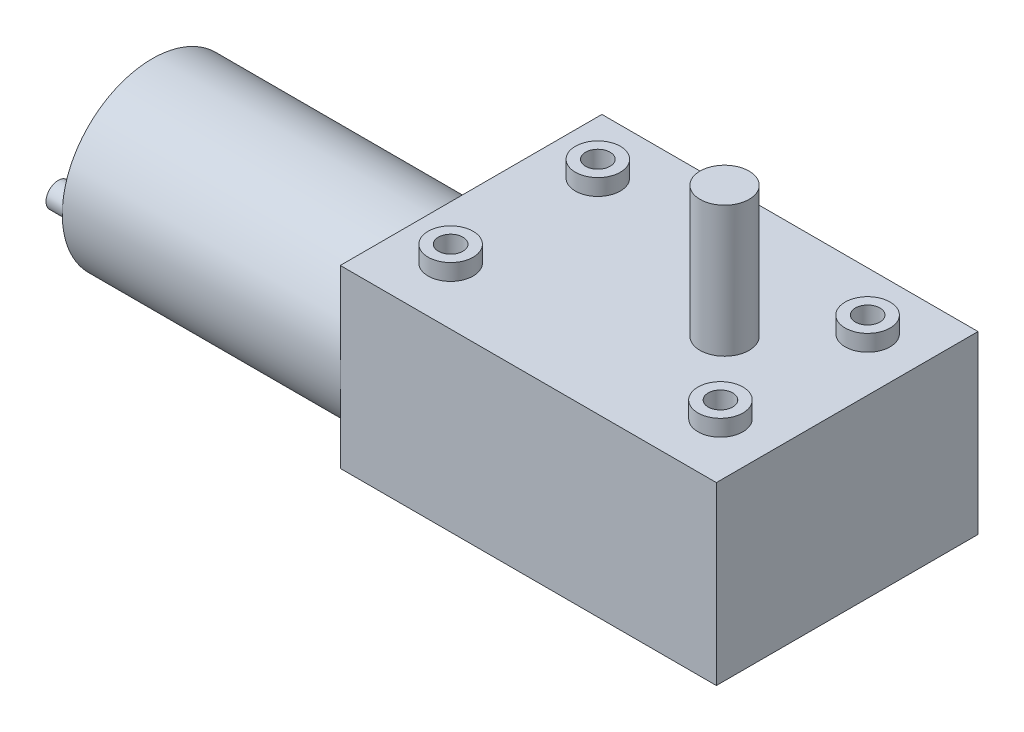
ISO-10303-21;
HEADER;
FILE_DESCRIPTION(('STEP AP214'),'2;1');
FILE_NAME('part.step','',(''),(''),'','','');
FILE_SCHEMA(('AUTOMOTIVE_DESIGN { 1 0 10303 214 1 1 1 1 }'));
ENDSEC;
DATA;
#1=APPLICATION_CONTEXT('core data for automotive mechanical design processes');
#2=APPLICATION_PROTOCOL_DEFINITION('international standard','automotive_design',2000,#1);
#3=PRODUCT_CONTEXT('',#1,'mechanical');
#4=PRODUCT('Part','Part','',(#3));
#5=PRODUCT_RELATED_PRODUCT_CATEGORY('part','',(#4));
#6=PRODUCT_DEFINITION_FORMATION('','',#4);
#7=PRODUCT_DEFINITION_CONTEXT('part definition',#1,'design');
#8=PRODUCT_DEFINITION('design','',#6,#7);
#9=PRODUCT_DEFINITION_SHAPE('','',#8);
#10=(LENGTH_UNIT() NAMED_UNIT(*) SI_UNIT(.MILLI.,.METRE.));
#11=(NAMED_UNIT(*) PLANE_ANGLE_UNIT() SI_UNIT($,.RADIAN.));
#12=(NAMED_UNIT(*) SI_UNIT($,.STERADIAN.) SOLID_ANGLE_UNIT());
#13=UNCERTAINTY_MEASURE_WITH_UNIT(LENGTH_MEASURE(1.E-05),#10,'distance_accuracy_value','');
#14=(GEOMETRIC_REPRESENTATION_CONTEXT(3) GLOBAL_UNCERTAINTY_ASSIGNED_CONTEXT((#13)) GLOBAL_UNIT_ASSIGNED_CONTEXT((#10,
#11,#12)) REPRESENTATION_CONTEXT('',''));
#15=CARTESIAN_POINT('',(0.,0.,0.));
#16=DIRECTION('',(0.,0.,1.));
#17=DIRECTION('',(1.,0.,0.));
#18=AXIS2_PLACEMENT_3D('',#15,#16,#17);
#19=CARTESIAN_POINT('',(-23.,21.5,16.));
#20=DIRECTION('',(1.,0.,0.));
#21=DIRECTION('',(0.,0.,-1.));
#22=AXIS2_PLACEMENT_3D('',#19,#20,#21);
#23=PLANE('',#22);
#24=CARTESIAN_POINT('',(-23.,9.9,5.));
#25=DIRECTION('',(-1.,0.,0.));
#26=DIRECTION('',(0.,0.,1.));
#27=AXIS2_PLACEMENT_3D('',#24,#25,#26);
#28=CIRCLE('',#27,11.);
#29=CARTESIAN_POINT('',(-23.,9.9,16.));
#30=VERTEX_POINT('',#29);
#31=CARTESIAN_POINT('',(-23.,0.,0.205211162105263));
#32=VERTEX_POINT('',#31);
#33=EDGE_CURVE('E47',#30,#32,#28,.T.);
#34=ORIENTED_EDGE('',*,*,#33,.F.);
#35=DIRECTION('',(0.,-1.,0.));
#36=VECTOR('',#35,1.);
#37=CARTESIAN_POINT('',(-23.,21.5,16.));
#38=LINE('',#37,#36);
#39=CARTESIAN_POINT('',(-23.,21.5,16.));
#40=VERTEX_POINT('',#39);
#41=EDGE_CURVE('E186',#40,#30,#38,.T.);
#42=ORIENTED_EDGE('',*,*,#41,.F.);
#43=DIRECTION('',(0.,0.,1.));
#44=VECTOR('',#43,1.);
#45=CARTESIAN_POINT('',(-23.,21.5,16.));
#46=LINE('',#45,#44);
#47=CARTESIAN_POINT('',(-23.,21.5,-16.));
#48=VERTEX_POINT('',#47);
#49=EDGE_CURVE('E168',#48,#40,#46,.T.);
#50=ORIENTED_EDGE('',*,*,#49,.F.);
#51=DIRECTION('',(0.,-1.,0.));
#52=VECTOR('',#51,1.);
#53=CARTESIAN_POINT('',(-23.,21.5,-16.));
#54=LINE('',#53,#52);
#55=CARTESIAN_POINT('',(-23.,0.,-16.));
#56=VERTEX_POINT('',#55);
#57=EDGE_CURVE('E188',#48,#56,#54,.T.);
#58=ORIENTED_EDGE('',*,*,#57,.T.);
#59=DIRECTION('',(0.,0.,1.));
#60=VECTOR('',#59,1.);
#61=CARTESIAN_POINT('',(-23.,0.,16.));
#62=LINE('',#61,#60);
#63=EDGE_CURVE('E178',#56,#32,#62,.T.);
#64=ORIENTED_EDGE('',*,*,#63,.T.);
#65=EDGE_LOOP('',(#34,#42,#50,#58,#64));
#66=FACE_BOUND('',#65,.T.);
#67=ADVANCED_FACE('F37',(#66),#23,.F.);
#68=CARTESIAN_POINT('',(0.,21.5,0.));
#69=DIRECTION('',(0.,-1.,0.));
#70=DIRECTION('',(0.,0.,-1.));
#71=AXIS2_PLACEMENT_3D('',#68,#69,#70);
#72=PLANE('',#71);
#73=CARTESIAN_POINT('',(8.,21.5,0.));
#74=DIRECTION('',(0.,-1.,0.));
#75=DIRECTION('',(0.,0.,-1.));
#76=AXIS2_PLACEMENT_3D('',#73,#74,#75);
#77=CIRCLE('',#76,3.);
#78=CARTESIAN_POINT('',(8.,21.5,-3.));
#79=VERTEX_POINT('',#78);
#80=EDGE_CURVE('E41',#79,#79,#77,.F.);
#81=ORIENTED_EDGE('',*,*,#80,.F.);
#82=EDGE_LOOP('',(#81));
#83=FACE_BOUND('',#82,.T.);
#84=CARTESIAN_POINT('',(16.5,21.5,9.));
#85=DIRECTION('',(0.,-1.,0.));
#86=DIRECTION('',(0.,0.,-1.));
#87=AXIS2_PLACEMENT_3D('',#84,#85,#86);
#88=CIRCLE('',#87,2.75);
#89=CARTESIAN_POINT('',(16.5,21.5,6.25));
#90=VERTEX_POINT('',#89);
#91=EDGE_CURVE('E200',#90,#90,#88,.F.);
#92=ORIENTED_EDGE('',*,*,#91,.F.);
#93=EDGE_LOOP('',(#92));
#94=FACE_BOUND('',#93,.T.);
#95=CARTESIAN_POINT('',(-16.5,21.5,-9.));
#96=DIRECTION('',(0.,-1.,0.));
#97=DIRECTION('',(0.,0.,-1.));
#98=AXIS2_PLACEMENT_3D('',#95,#96,#97);
#99=CIRCLE('',#98,2.75);
#100=CARTESIAN_POINT('',(-16.5,21.5,-11.75));
#101=VERTEX_POINT('',#100);
#102=EDGE_CURVE('E194',#101,#101,#99,.F.);
#103=ORIENTED_EDGE('',*,*,#102,.F.);
#104=EDGE_LOOP('',(#103));
#105=FACE_BOUND('',#104,.T.);
#106=DIRECTION('',(0.,0.,-1.));
#107=VECTOR('',#106,1.);
#108=CARTESIAN_POINT('',(23.,21.5,16.));
#109=LINE('',#108,#107);
#110=CARTESIAN_POINT('',(23.,21.5,16.));
#111=VERTEX_POINT('',#110);
#112=CARTESIAN_POINT('',(23.,21.5,-16.));
#113=VERTEX_POINT('',#112);
#114=EDGE_CURVE('E162',#111,#113,#109,.T.);
#115=ORIENTED_EDGE('',*,*,#114,.T.);
#116=DIRECTION('',(-1.,0.,0.));
#117=VECTOR('',#116,1.);
#118=CARTESIAN_POINT('',(-23.,21.5,-16.));
#119=LINE('',#118,#117);
#120=EDGE_CURVE('E165',#113,#48,#119,.T.);
#121=ORIENTED_EDGE('',*,*,#120,.T.);
#122=ORIENTED_EDGE('',*,*,#49,.T.);
#123=DIRECTION('',(1.,0.,0.));
#124=VECTOR('',#123,1.);
#125=CARTESIAN_POINT('',(-23.,21.5,16.));
#126=LINE('',#125,#124);
#127=EDGE_CURVE('E170',#40,#111,#126,.T.);
#128=ORIENTED_EDGE('',*,*,#127,.T.);
#129=EDGE_LOOP('',(#115,#121,#122,#128));
#130=FACE_BOUND('',#129,.T.);
#131=CARTESIAN_POINT('',(-16.5,21.5,9.));
#132=DIRECTION('',(0.,-1.,0.));
#133=DIRECTION('',(0.,0.,-1.));
#134=AXIS2_PLACEMENT_3D('',#131,#132,#133);
#135=CIRCLE('',#134,2.75);
#136=CARTESIAN_POINT('',(-16.5,21.5,6.25));
#137=VERTEX_POINT('',#136);
#138=EDGE_CURVE('E197',#137,#137,#135,.F.);
#139=ORIENTED_EDGE('',*,*,#138,.F.);
#140=EDGE_LOOP('',(#139));
#141=FACE_BOUND('',#140,.T.);
#142=CARTESIAN_POINT('',(16.5,21.5,-9.));
#143=DIRECTION('',(0.,-1.,0.));
#144=DIRECTION('',(0.,0.,-1.));
#145=AXIS2_PLACEMENT_3D('',#142,#143,#144);
#146=CIRCLE('',#145,2.75);
#147=CARTESIAN_POINT('',(16.5,21.5,-11.75));
#148=VERTEX_POINT('',#147);
#149=EDGE_CURVE('E202',#148,#148,#146,.F.);
#150=ORIENTED_EDGE('',*,*,#149,.F.);
#151=EDGE_LOOP('',(#150));
#152=FACE_BOUND('',#151,.T.);
#153=ADVANCED_FACE('F211',(#83,#94,#105,#130,#141,#152),#72,.F.);
#154=CARTESIAN_POINT('',(23.,21.5,16.));
#155=DIRECTION('',(-1.,0.,0.));
#156=DIRECTION('',(0.,0.,1.));
#157=AXIS2_PLACEMENT_3D('',#154,#155,#156);
#158=PLANE('',#157);
#159=DIRECTION('',(0.,0.,-1.));
#160=VECTOR('',#159,1.);
#161=CARTESIAN_POINT('',(23.,0.,16.));
#162=LINE('',#161,#160);
#163=CARTESIAN_POINT('',(23.,0.,16.));
#164=VERTEX_POINT('',#163);
#165=CARTESIAN_POINT('',(23.,0.,-16.));
#166=VERTEX_POINT('',#165);
#167=EDGE_CURVE('E161',#164,#166,#162,.T.);
#168=ORIENTED_EDGE('',*,*,#167,.T.);
#169=DIRECTION('',(0.,-1.,0.));
#170=VECTOR('',#169,1.);
#171=CARTESIAN_POINT('',(23.,21.5,-16.));
#172=LINE('',#171,#170);
#173=EDGE_CURVE('E191',#113,#166,#172,.T.);
#174=ORIENTED_EDGE('',*,*,#173,.F.);
#175=ORIENTED_EDGE('',*,*,#114,.F.);
#176=DIRECTION('',(0.,-1.,0.));
#177=VECTOR('',#176,1.);
#178=CARTESIAN_POINT('',(23.,21.5,16.));
#179=LINE('',#178,#177);
#180=EDGE_CURVE('E172',#111,#164,#179,.T.);
#181=ORIENTED_EDGE('',*,*,#180,.T.);
#182=EDGE_LOOP('',(#168,#174,#175,#181));
#183=FACE_BOUND('',#182,.T.);
#184=ADVANCED_FACE('F39',(#183),#158,.F.);
#185=CARTESIAN_POINT('',(-23.,21.5,-16.));
#186=DIRECTION('',(0.,0.,1.));
#187=DIRECTION('',(1.,0.,0.));
#188=AXIS2_PLACEMENT_3D('',#185,#186,#187);
#189=PLANE('',#188);
#190=DIRECTION('',(-1.,0.,0.));
#191=VECTOR('',#190,1.);
#192=CARTESIAN_POINT('',(-23.,0.,-16.));
#193=LINE('',#192,#191);
#194=EDGE_CURVE('E175',#166,#56,#193,.T.);
#195=ORIENTED_EDGE('',*,*,#194,.T.);
#196=ORIENTED_EDGE('',*,*,#57,.F.);
#197=ORIENTED_EDGE('',*,*,#120,.F.);
#198=ORIENTED_EDGE('',*,*,#173,.T.);
#199=EDGE_LOOP('',(#195,#196,#197,#198));
#200=FACE_BOUND('',#199,.T.);
#201=ADVANCED_FACE('F253',(#200),#189,.F.);
#202=CARTESIAN_POINT('',(-23.,0.,9.79478883789475));
#203=VERTEX_POINT('',#202);
#204=EDGE_CURVE('E11',#203,#30,#28,.T.);
#205=ORIENTED_EDGE('',*,*,#204,.F.);
#206=CARTESIAN_POINT('',(-23.,0.,16.));
#207=VERTEX_POINT('',#206);
#208=EDGE_CURVE('E177',#203,#207,#62,.T.);
#209=ORIENTED_EDGE('',*,*,#208,.T.);
#210=EDGE_CURVE('E185',#30,#207,#38,.T.);
#211=ORIENTED_EDGE('',*,*,#210,.F.);
#212=EDGE_LOOP('',(#205,#209,#211));
#213=FACE_BOUND('',#212,.T.);
#214=ADVANCED_FACE('F246',(#213),#23,.F.);
#215=CARTESIAN_POINT('',(-23.,21.5,16.));
#216=DIRECTION('',(0.,0.,-1.));
#217=DIRECTION('',(-1.,0.,0.));
#218=AXIS2_PLACEMENT_3D('',#215,#216,#217);
#219=PLANE('',#218);
#220=DIRECTION('',(1.,0.,0.));
#221=VECTOR('',#220,1.);
#222=CARTESIAN_POINT('',(-23.,0.,16.));
#223=LINE('',#222,#221);
#224=EDGE_CURVE('E166',#207,#164,#223,.T.);
#225=ORIENTED_EDGE('',*,*,#224,.T.);
#226=ORIENTED_EDGE('',*,*,#180,.F.);
#227=ORIENTED_EDGE('',*,*,#127,.F.);
#228=ORIENTED_EDGE('',*,*,#41,.T.);
#229=ORIENTED_EDGE('',*,*,#210,.T.);
#230=EDGE_LOOP('',(#225,#226,#227,#228,#229));
#231=FACE_BOUND('',#230,.T.);
#232=ADVANCED_FACE('F252',(#231),#219,.F.);
#233=CARTESIAN_POINT('',(0.,0.,0.));
#234=DIRECTION('',(0.,-1.,0.));
#235=DIRECTION('',(0.,0.,-1.));
#236=AXIS2_PLACEMENT_3D('',#233,#234,#235);
#237=PLANE('',#236);
#238=ORIENTED_EDGE('',*,*,#167,.F.);
#239=ORIENTED_EDGE('',*,*,#224,.F.);
#240=ORIENTED_EDGE('',*,*,#208,.F.);
#241=EDGE_CURVE('E181',#32,#203,#62,.T.);
#242=ORIENTED_EDGE('',*,*,#241,.F.);
#243=ORIENTED_EDGE('',*,*,#63,.F.);
#244=ORIENTED_EDGE('',*,*,#194,.F.);
#245=EDGE_LOOP('',(#238,#239,#240,#242,#243,#244));
#246=FACE_BOUND('',#245,.T.);
#247=ADVANCED_FACE('F258',(#246),#237,.T.);
#248=CARTESIAN_POINT('',(-16.5,23.5,-9.));
#249=DIRECTION('',(0.,1.,0.));
#250=DIRECTION('',(0.,0.,1.));
#251=AXIS2_PLACEMENT_3D('',#248,#249,#250);
#252=PLANE('',#251);
#253=CARTESIAN_POINT('',(-16.5,23.5,-9.));
#254=DIRECTION('',(0.,1.,0.));
#255=DIRECTION('',(0.,0.,1.));
#256=AXIS2_PLACEMENT_3D('',#253,#254,#255);
#257=CIRCLE('',#256,2.75);
#258=CARTESIAN_POINT('',(-16.5,23.5,-6.25));
#259=VERTEX_POINT('',#258);
#260=EDGE_CURVE('E146',#259,#259,#257,.T.);
#261=ORIENTED_EDGE('',*,*,#260,.T.);
#262=EDGE_LOOP('',(#261));
#263=FACE_BOUND('',#262,.T.);
#264=CARTESIAN_POINT('',(-16.5,23.5,-9.));
#265=DIRECTION('',(0.,1.,0.));
#266=DIRECTION('',(0.,0.,1.));
#267=AXIS2_PLACEMENT_3D('',#264,#265,#266);
#268=CIRCLE('',#267,1.5);
#269=CARTESIAN_POINT('',(-16.5,23.5,-7.5));
#270=VERTEX_POINT('',#269);
#271=EDGE_CURVE('E143',#270,#270,#268,.T.);
#272=ORIENTED_EDGE('',*,*,#271,.F.);
#273=EDGE_LOOP('',(#272));
#274=FACE_BOUND('',#273,.T.);
#275=ADVANCED_FACE('F361',(#263,#274),#252,.T.);
#276=CARTESIAN_POINT('',(-16.5,23.5,-9.));
#277=DIRECTION('',(0.,-1.,0.));
#278=DIRECTION('',(0.,0.,-1.));
#279=AXIS2_PLACEMENT_3D('',#276,#277,#278);
#280=CYLINDRICAL_SURFACE('',#279,2.75);
#281=ORIENTED_EDGE('',*,*,#260,.F.);
#282=EDGE_LOOP('',(#281));
#283=FACE_BOUND('',#282,.T.);
#284=ORIENTED_EDGE('',*,*,#102,.T.);
#285=EDGE_LOOP('',(#284));
#286=FACE_BOUND('',#285,.T.);
#287=ADVANCED_FACE('F365',(#283,#286),#280,.T.);
#288=CARTESIAN_POINT('',(-16.5,15.91,-9.));
#289=DIRECTION('',(0.,1.,0.));
#290=DIRECTION('',(0.,0.,1.));
#291=AXIS2_PLACEMENT_3D('',#288,#289,#290);
#292=CONICAL_SURFACE('',#291,1.5,1.02974425867665);
#293=CARTESIAN_POINT('',(-16.5,15.0087090714587,-9.));
#294=VERTEX_POINT('',#293);
#295=VERTEX_LOOP('',#294);
#296=FACE_BOUND('',#295,.T.);
#297=CARTESIAN_POINT('',(-16.5,15.91,-9.));
#298=DIRECTION('',(0.,1.,0.));
#299=DIRECTION('',(0.,0.,1.));
#300=AXIS2_PLACEMENT_3D('',#297,#298,#299);
#301=CIRCLE('',#300,1.5);
#302=CARTESIAN_POINT('',(-16.5,15.91,-7.5));
#303=VERTEX_POINT('',#302);
#304=EDGE_CURVE('E149',#303,#303,#301,.T.);
#305=ORIENTED_EDGE('',*,*,#304,.T.);
#306=EDGE_LOOP('',(#305));
#307=FACE_BOUND('',#306,.T.);
#308=ADVANCED_FACE('F370',(#296,#307),#292,.F.);
#309=CARTESIAN_POINT('',(-16.5,21.5,-9.));
#310=DIRECTION('',(0.,1.,0.));
#311=DIRECTION('',(0.,0.,1.));
#312=AXIS2_PLACEMENT_3D('',#309,#310,#311);
#313=CYLINDRICAL_SURFACE('',#312,1.5);
#314=ORIENTED_EDGE('',*,*,#304,.F.);
#315=EDGE_LOOP('',(#314));
#316=FACE_BOUND('',#315,.T.);
#317=ORIENTED_EDGE('',*,*,#271,.T.);
#318=EDGE_LOOP('',(#317));
#319=FACE_BOUND('',#318,.T.);
#320=ADVANCED_FACE('F238',(#316,#319),#313,.F.);
#321=CARTESIAN_POINT('',(-16.5,23.5,9.));
#322=DIRECTION('',(0.,-1.,0.));
#323=DIRECTION('',(0.,0.,-1.));
#324=AXIS2_PLACEMENT_3D('',#321,#322,#323);
#325=PLANE('',#324);
#326=CARTESIAN_POINT('',(-16.5,23.5,9.));
#327=DIRECTION('',(0.,1.,0.));
#328=DIRECTION('',(0.,0.,-1.));
#329=AXIS2_PLACEMENT_3D('',#326,#327,#328);
#330=CIRCLE('',#329,2.75);
#331=CARTESIAN_POINT('',(-16.5,23.5,6.25));
#332=VERTEX_POINT('',#331);
#333=EDGE_CURVE('E140',#332,#332,#330,.T.);
#334=ORIENTED_EDGE('',*,*,#333,.T.);
#335=EDGE_LOOP('',(#334));
#336=FACE_BOUND('',#335,.T.);
#337=CARTESIAN_POINT('',(-16.5,23.5,9.));
#338=DIRECTION('',(0.,1.,0.));
#339=DIRECTION('',(0.,0.,-1.));
#340=AXIS2_PLACEMENT_3D('',#337,#338,#339);
#341=CIRCLE('',#340,1.5);
#342=CARTESIAN_POINT('',(-16.5,23.5,7.5));
#343=VERTEX_POINT('',#342);
#344=EDGE_CURVE('E137',#343,#343,#341,.T.);
#345=ORIENTED_EDGE('',*,*,#344,.F.);
#346=EDGE_LOOP('',(#345));
#347=FACE_BOUND('',#346,.T.);
#348=ADVANCED_FACE('F228',(#336,#347),#325,.F.);
#349=CARTESIAN_POINT('',(-16.5,23.5,9.));
#350=DIRECTION('',(0.,-1.,0.));
#351=DIRECTION('',(0.,0.,-1.));
#352=AXIS2_PLACEMENT_3D('',#349,#350,#351);
#353=CYLINDRICAL_SURFACE('',#352,2.75);
#354=ORIENTED_EDGE('',*,*,#333,.F.);
#355=EDGE_LOOP('',(#354));
#356=FACE_BOUND('',#355,.T.);
#357=ORIENTED_EDGE('',*,*,#138,.T.);
#358=EDGE_LOOP('',(#357));
#359=FACE_BOUND('',#358,.T.);
#360=ADVANCED_FACE('F225',(#356,#359),#353,.T.);
#361=CARTESIAN_POINT('',(-16.5,15.91,9.));
#362=DIRECTION('',(0.,1.,0.));
#363=DIRECTION('',(0.,0.,1.));
#364=AXIS2_PLACEMENT_3D('',#361,#362,#363);
#365=CONICAL_SURFACE('',#364,1.5,1.02974425867665);
#366=CARTESIAN_POINT('',(-16.5,15.0087090714587,9.));
#367=VERTEX_POINT('',#366);
#368=VERTEX_LOOP('',#367);
#369=FACE_BOUND('',#368,.T.);
#370=CARTESIAN_POINT('',(-16.5,15.91,9.));
#371=DIRECTION('',(0.,1.,0.));
#372=DIRECTION('',(0.,0.,1.));
#373=AXIS2_PLACEMENT_3D('',#370,#371,#372);
#374=CIRCLE('',#373,1.5);
#375=CARTESIAN_POINT('',(-16.5,15.91,10.5));
#376=VERTEX_POINT('',#375);
#377=EDGE_CURVE('E158',#376,#376,#374,.T.);
#378=ORIENTED_EDGE('',*,*,#377,.T.);
#379=EDGE_LOOP('',(#378));
#380=FACE_BOUND('',#379,.T.);
#381=ADVANCED_FACE('F227',(#369,#380),#365,.F.);
#382=CARTESIAN_POINT('',(-16.5,21.5,9.));
#383=DIRECTION('',(0.,1.,0.));
#384=DIRECTION('',(0.,0.,1.));
#385=AXIS2_PLACEMENT_3D('',#382,#383,#384);
#386=CYLINDRICAL_SURFACE('',#385,1.5);
#387=ORIENTED_EDGE('',*,*,#377,.F.);
#388=EDGE_LOOP('',(#387));
#389=FACE_BOUND('',#388,.T.);
#390=ORIENTED_EDGE('',*,*,#344,.T.);
#391=EDGE_LOOP('',(#390));
#392=FACE_BOUND('',#391,.T.);
#393=ADVANCED_FACE('F235',(#389,#392),#386,.F.);
#394=CARTESIAN_POINT('',(16.5,23.5,9.));
#395=DIRECTION('',(0.,1.,0.));
#396=DIRECTION('',(0.,0.,1.));
#397=AXIS2_PLACEMENT_3D('',#394,#395,#396);
#398=PLANE('',#397);
#399=CARTESIAN_POINT('',(16.5,23.5,9.));
#400=DIRECTION('',(0.,1.,0.));
#401=DIRECTION('',(0.,0.,1.));
#402=AXIS2_PLACEMENT_3D('',#399,#400,#401);
#403=CIRCLE('',#402,2.75);
#404=CARTESIAN_POINT('',(16.5,23.5,11.75));
#405=VERTEX_POINT('',#404);
#406=EDGE_CURVE('E134',#405,#405,#403,.T.);
#407=ORIENTED_EDGE('',*,*,#406,.T.);
#408=EDGE_LOOP('',(#407));
#409=FACE_BOUND('',#408,.T.);
#410=CARTESIAN_POINT('',(16.5,23.5,9.));
#411=DIRECTION('',(0.,1.,0.));
#412=DIRECTION('',(0.,0.,1.));
#413=AXIS2_PLACEMENT_3D('',#410,#411,#412);
#414=CIRCLE('',#413,1.5);
#415=CARTESIAN_POINT('',(16.5,23.5,10.5));
#416=VERTEX_POINT('',#415);
#417=EDGE_CURVE('E131',#416,#416,#414,.T.);
#418=ORIENTED_EDGE('',*,*,#417,.F.);
#419=EDGE_LOOP('',(#418));
#420=FACE_BOUND('',#419,.T.);
#421=ADVANCED_FACE('F330',(#409,#420),#398,.T.);
#422=CARTESIAN_POINT('',(16.5,23.5,9.));
#423=DIRECTION('',(0.,-1.,0.));
#424=DIRECTION('',(0.,0.,-1.));
#425=AXIS2_PLACEMENT_3D('',#422,#423,#424);
#426=CYLINDRICAL_SURFACE('',#425,2.75);
#427=ORIENTED_EDGE('',*,*,#406,.F.);
#428=EDGE_LOOP('',(#427));
#429=FACE_BOUND('',#428,.T.);
#430=ORIENTED_EDGE('',*,*,#91,.T.);
#431=EDGE_LOOP('',(#430));
#432=FACE_BOUND('',#431,.T.);
#433=ADVANCED_FACE('F333',(#429,#432),#426,.T.);
#434=CARTESIAN_POINT('',(16.5,15.91,9.));
#435=DIRECTION('',(0.,1.,0.));
#436=DIRECTION('',(0.,0.,1.));
#437=AXIS2_PLACEMENT_3D('',#434,#435,#436);
#438=CONICAL_SURFACE('',#437,1.5,1.02974425867665);
#439=CARTESIAN_POINT('',(16.5,15.0087090714587,9.));
#440=VERTEX_POINT('',#439);
#441=VERTEX_LOOP('',#440);
#442=FACE_BOUND('',#441,.T.);
#443=CARTESIAN_POINT('',(16.5,15.91,9.));
#444=DIRECTION('',(0.,1.,0.));
#445=DIRECTION('',(0.,0.,1.));
#446=AXIS2_PLACEMENT_3D('',#443,#444,#445);
#447=CIRCLE('',#446,1.5);
#448=CARTESIAN_POINT('',(16.5,15.91,10.5));
#449=VERTEX_POINT('',#448);
#450=EDGE_CURVE('E155',#449,#449,#447,.T.);
#451=ORIENTED_EDGE('',*,*,#450,.T.);
#452=EDGE_LOOP('',(#451));
#453=FACE_BOUND('',#452,.T.);
#454=ADVANCED_FACE('F336',(#442,#453),#438,.F.);
#455=CARTESIAN_POINT('',(16.5,21.5,9.));
#456=DIRECTION('',(0.,1.,0.));
#457=DIRECTION('',(0.,0.,1.));
#458=AXIS2_PLACEMENT_3D('',#455,#456,#457);
#459=CYLINDRICAL_SURFACE('',#458,1.5);
#460=ORIENTED_EDGE('',*,*,#450,.F.);
#461=EDGE_LOOP('',(#460));
#462=FACE_BOUND('',#461,.T.);
#463=ORIENTED_EDGE('',*,*,#417,.T.);
#464=EDGE_LOOP('',(#463));
#465=FACE_BOUND('',#464,.T.);
#466=ADVANCED_FACE('F324',(#462,#465),#459,.F.);
#467=CARTESIAN_POINT('',(16.5,23.5,-9.));
#468=DIRECTION('',(0.,-1.,0.));
#469=DIRECTION('',(0.,0.,-1.));
#470=AXIS2_PLACEMENT_3D('',#467,#468,#469);
#471=PLANE('',#470);
#472=CARTESIAN_POINT('',(16.5,23.5,-9.));
#473=DIRECTION('',(0.,1.,0.));
#474=DIRECTION('',(0.,0.,-1.));
#475=AXIS2_PLACEMENT_3D('',#472,#473,#474);
#476=CIRCLE('',#475,2.75);
#477=CARTESIAN_POINT('',(16.5,23.5,-11.75));
#478=VERTEX_POINT('',#477);
#479=EDGE_CURVE('E128',#478,#478,#476,.T.);
#480=ORIENTED_EDGE('',*,*,#479,.T.);
#481=EDGE_LOOP('',(#480));
#482=FACE_BOUND('',#481,.T.);
#483=CARTESIAN_POINT('',(16.5,23.5,-9.));
#484=DIRECTION('',(0.,1.,0.));
#485=DIRECTION('',(0.,0.,-1.));
#486=AXIS2_PLACEMENT_3D('',#483,#484,#485);
#487=CIRCLE('',#486,1.5);
#488=CARTESIAN_POINT('',(16.5,23.5,-10.5));
#489=VERTEX_POINT('',#488);
#490=EDGE_CURVE('E120',#489,#489,#487,.T.);
#491=ORIENTED_EDGE('',*,*,#490,.F.);
#492=EDGE_LOOP('',(#491));
#493=FACE_BOUND('',#492,.T.);
#494=ADVANCED_FACE('F320',(#482,#493),#471,.F.);
#495=CARTESIAN_POINT('',(16.5,23.5,-9.));
#496=DIRECTION('',(0.,-1.,0.));
#497=DIRECTION('',(0.,0.,-1.));
#498=AXIS2_PLACEMENT_3D('',#495,#496,#497);
#499=CYLINDRICAL_SURFACE('',#498,2.75);
#500=ORIENTED_EDGE('',*,*,#479,.F.);
#501=EDGE_LOOP('',(#500));
#502=FACE_BOUND('',#501,.T.);
#503=ORIENTED_EDGE('',*,*,#149,.T.);
#504=EDGE_LOOP('',(#503));
#505=FACE_BOUND('',#504,.T.);
#506=ADVANCED_FACE('F323',(#502,#505),#499,.T.);
#507=CARTESIAN_POINT('',(16.5,15.91,-9.));
#508=DIRECTION('',(0.,1.,0.));
#509=DIRECTION('',(0.,0.,1.));
#510=AXIS2_PLACEMENT_3D('',#507,#508,#509);
#511=CONICAL_SURFACE('',#510,1.5,1.02974425867665);
#512=CARTESIAN_POINT('',(16.5,15.0087090714587,-9.));
#513=VERTEX_POINT('',#512);
#514=VERTEX_LOOP('',#513);
#515=FACE_BOUND('',#514,.T.);
#516=CARTESIAN_POINT('',(16.5,15.91,-9.));
#517=DIRECTION('',(0.,1.,0.));
#518=DIRECTION('',(0.,0.,1.));
#519=AXIS2_PLACEMENT_3D('',#516,#517,#518);
#520=CIRCLE('',#519,1.5);
#521=CARTESIAN_POINT('',(16.5,15.91,-7.5));
#522=VERTEX_POINT('',#521);
#523=EDGE_CURVE('E152',#522,#522,#520,.T.);
#524=ORIENTED_EDGE('',*,*,#523,.T.);
#525=EDGE_LOOP('',(#524));
#526=FACE_BOUND('',#525,.T.);
#527=ADVANCED_FACE('F328',(#515,#526),#511,.F.);
#528=CARTESIAN_POINT('',(16.5,21.5,-9.));
#529=DIRECTION('',(0.,1.,0.));
#530=DIRECTION('',(0.,0.,1.));
#531=AXIS2_PLACEMENT_3D('',#528,#529,#530);
#532=CYLINDRICAL_SURFACE('',#531,1.5);
#533=ORIENTED_EDGE('',*,*,#523,.F.);
#534=EDGE_LOOP('',(#533));
#535=FACE_BOUND('',#534,.T.);
#536=ORIENTED_EDGE('',*,*,#490,.T.);
#537=EDGE_LOOP('',(#536));
#538=FACE_BOUND('',#537,.T.);
#539=ADVANCED_FACE('F318',(#535,#538),#532,.F.);
#540=CARTESIAN_POINT('',(8.,37.5,0.));
#541=DIRECTION('',(0.,-1.,0.));
#542=DIRECTION('',(0.,0.,-1.));
#543=AXIS2_PLACEMENT_3D('',#540,#541,#542);
#544=CYLINDRICAL_SURFACE('',#543,3.);
#545=CARTESIAN_POINT('',(8.,37.5,0.));
#546=DIRECTION('',(0.,1.,0.));
#547=DIRECTION('',(0.,0.,1.));
#548=AXIS2_PLACEMENT_3D('',#545,#546,#547);
#549=CIRCLE('',#548,3.);
#550=CARTESIAN_POINT('',(8.,37.5,3.));
#551=VERTEX_POINT('',#550);
#552=EDGE_CURVE('E118',#551,#551,#549,.T.);
#553=ORIENTED_EDGE('',*,*,#552,.F.);
#554=EDGE_LOOP('',(#553));
#555=FACE_BOUND('',#554,.T.);
#556=ORIENTED_EDGE('',*,*,#80,.T.);
#557=EDGE_LOOP('',(#556));
#558=FACE_BOUND('',#557,.T.);
#559=ADVANCED_FACE('F209',(#555,#558),#544,.T.);
#560=CARTESIAN_POINT('',(8.,37.5,0.));
#561=DIRECTION('',(0.,1.,0.));
#562=DIRECTION('',(0.,0.,1.));
#563=AXIS2_PLACEMENT_3D('',#560,#561,#562);
#564=PLANE('',#563);
#565=ORIENTED_EDGE('',*,*,#552,.T.);
#566=EDGE_LOOP('',(#565));
#567=FACE_BOUND('',#566,.T.);
#568=ADVANCED_FACE('F310',(#567),#564,.T.);
#569=CARTESIAN_POINT('',(-23.,9.9,5.));
#570=DIRECTION('',(-1.,0.,0.));
#571=DIRECTION('',(0.,0.,1.));
#572=AXIS2_PLACEMENT_3D('',#569,#570,#571);
#573=PLANE('',#572);
#574=EDGE_CURVE('E48',#32,#203,#28,.T.);
#575=ORIENTED_EDGE('',*,*,#574,.F.);
#576=ORIENTED_EDGE('',*,*,#241,.T.);
#577=EDGE_LOOP('',(#575,#576));
#578=FACE_BOUND('',#577,.T.);
#579=ADVANCED_FACE('F307',(#578),#573,.F.);
#580=CARTESIAN_POINT('',(-57.,9.9,5.));
#581=DIRECTION('',(1.,0.,0.));
#582=DIRECTION('',(0.,0.,-1.));
#583=AXIS2_PLACEMENT_3D('',#580,#581,#582);
#584=CYLINDRICAL_SURFACE('',#583,11.);
#585=CARTESIAN_POINT('',(-57.,9.9,5.));
#586=DIRECTION('',(-1.,0.,0.));
#587=DIRECTION('',(0.,0.,1.));
#588=AXIS2_PLACEMENT_3D('',#585,#586,#587);
#589=CIRCLE('',#588,11.);
#590=CARTESIAN_POINT('',(-57.,10.3195591187715,15.9919957307968));
#591=VERTEX_POINT('',#590);
#592=CARTESIAN_POINT('',(-57.,10.2661598447566,-5.99390408217607));
#593=VERTEX_POINT('',#592);
#594=EDGE_CURVE('E114',#591,#593,#589,.T.);
#595=ORIENTED_EDGE('',*,*,#594,.F.);
#596=EDGE_CURVE('E107',#593,#591,#589,.T.);
#597=ORIENTED_EDGE('',*,*,#596,.F.);
#598=EDGE_LOOP('',(#595,#597));
#599=FACE_BOUND('',#598,.T.);
#600=ORIENTED_EDGE('',*,*,#33,.T.);
#601=ORIENTED_EDGE('',*,*,#574,.T.);
#602=ORIENTED_EDGE('',*,*,#204,.T.);
#603=EDGE_LOOP('',(#600,#601,#602));
#604=FACE_BOUND('',#603,.T.);
#605=ADVANCED_FACE('F116',(#599,#604),#584,.T.);
#606=CARTESIAN_POINT('',(-57.,9.9,5.));
#607=DIRECTION('',(-1.,0.,0.));
#608=DIRECTION('',(0.,0.,1.));
#609=AXIS2_PLACEMENT_3D('',#606,#607,#608);
#610=PLANE('',#609);
#611=ORIENTED_EDGE('',*,*,#594,.T.);
#612=CARTESIAN_POINT('',(-57.,10.2162289568352,-4.49473534369752));
#613=DIRECTION('',(-1.,0.,0.));
#614=DIRECTION('',(0.,0.,1.));
#615=AXIS2_PLACEMENT_3D('',#612,#613,#614);
#616=CIRCLE('',#615,1.5);
#617=EDGE_CURVE('E53',#593,#593,#616,.T.);
#618=ORIENTED_EDGE('',*,*,#617,.F.);
#619=ORIENTED_EDGE('',*,*,#596,.T.);
#620=CARTESIAN_POINT('',(-57.,10.2623465116663,14.4930872220518));
#621=DIRECTION('',(-1.,0.,0.));
#622=DIRECTION('',(0.,0.,1.));
#623=AXIS2_PLACEMENT_3D('',#620,#621,#622);
#624=CIRCLE('',#623,1.5);
#625=EDGE_CURVE('E112',#591,#591,#624,.T.);
#626=ORIENTED_EDGE('',*,*,#625,.F.);
#627=EDGE_LOOP('',(#611,#618,#619,#626));
#628=FACE_BOUND('',#627,.T.);
#629=ADVANCED_FACE('F110',(#628),#610,.T.);
#630=CARTESIAN_POINT('',(-59.,10.2623465116663,14.4930872220518));
#631=DIRECTION('',(1.,0.,0.));
#632=DIRECTION('',(0.,0.,-1.));
#633=AXIS2_PLACEMENT_3D('',#630,#631,#632);
#634=CYLINDRICAL_SURFACE('',#633,1.5);
#635=CARTESIAN_POINT('',(-59.,10.2623465116663,14.4930872220518));
#636=DIRECTION('',(-1.,0.,0.));
#637=DIRECTION('',(0.,0.,1.));
#638=AXIS2_PLACEMENT_3D('',#635,#636,#637);
#639=CIRCLE('',#638,1.5);
#640=CARTESIAN_POINT('',(-59.,10.2623465116663,15.9930872220518));
#641=VERTEX_POINT('',#640);
#642=EDGE_CURVE('E278',#641,#641,#639,.T.);
#643=ORIENTED_EDGE('',*,*,#642,.F.);
#644=EDGE_LOOP('',(#643));
#645=FACE_BOUND('',#644,.T.);
#646=ORIENTED_EDGE('',*,*,#625,.T.);
#647=EDGE_LOOP('',(#646));
#648=FACE_BOUND('',#647,.T.);
#649=ADVANCED_FACE('F299',(#645,#648),#634,.T.);
#650=CARTESIAN_POINT('',(-59.,10.2623465116663,14.4930872220518));
#651=DIRECTION('',(-1.,0.,0.));
#652=DIRECTION('',(0.,0.,1.));
#653=AXIS2_PLACEMENT_3D('',#650,#651,#652);
#654=PLANE('',#653);
#655=ORIENTED_EDGE('',*,*,#642,.T.);
#656=EDGE_LOOP('',(#655));
#657=FACE_BOUND('',#656,.T.);
#658=ADVANCED_FACE('F292',(#657),#654,.T.);
#659=CARTESIAN_POINT('',(-59.,10.2162289568352,-4.49473534369752));
#660=DIRECTION('',(1.,0.,0.));
#661=DIRECTION('',(0.,0.,-1.));
#662=AXIS2_PLACEMENT_3D('',#659,#660,#661);
#663=CYLINDRICAL_SURFACE('',#662,1.5);
#664=CARTESIAN_POINT('',(-59.,10.2162289568352,-4.49473534369752));
#665=DIRECTION('',(-1.,0.,0.));
#666=DIRECTION('',(0.,0.,1.));
#667=AXIS2_PLACEMENT_3D('',#664,#665,#666);
#668=CIRCLE('',#667,1.5);
#669=CARTESIAN_POINT('',(-59.,10.2162289568352,-2.99473534369752));
#670=VERTEX_POINT('',#669);
#671=EDGE_CURVE('E282',#670,#670,#668,.T.);
#672=ORIENTED_EDGE('',*,*,#671,.F.);
#673=EDGE_LOOP('',(#672));
#674=FACE_BOUND('',#673,.T.);
#675=ORIENTED_EDGE('',*,*,#617,.T.);
#676=EDGE_LOOP('',(#675));
#677=FACE_BOUND('',#676,.T.);
#678=ADVANCED_FACE('F290',(#674,#677),#663,.T.);
#679=CARTESIAN_POINT('',(-59.,10.2162289568352,-4.49473534369752));
#680=DIRECTION('',(-1.,0.,0.));
#681=DIRECTION('',(0.,0.,1.));
#682=AXIS2_PLACEMENT_3D('',#679,#680,#681);
#683=PLANE('',#682);
#684=ORIENTED_EDGE('',*,*,#671,.T.);
#685=EDGE_LOOP('',(#684));
#686=FACE_BOUND('',#685,.T.);
#687=ADVANCED_FACE('F288',(#686),#683,.T.);
#688=CLOSED_SHELL('',(#67,#153,#184,#201,#214,#232,#247,#275,#287,#308,#320,#348,#360,#381,#393,
#421,#433,#454,#466,#494,#506,#527,#539,#559,#568,#579,#605,#629,#649,#658,#678,#687));
#689=MANIFOLD_SOLID_BREP('B2',#688);
#690=ADVANCED_BREP_SHAPE_REPRESENTATION('',(#18,#689),#14);
#691=SHAPE_DEFINITION_REPRESENTATION(#9,#690);
ENDSEC;
END-ISO-10303-21;
